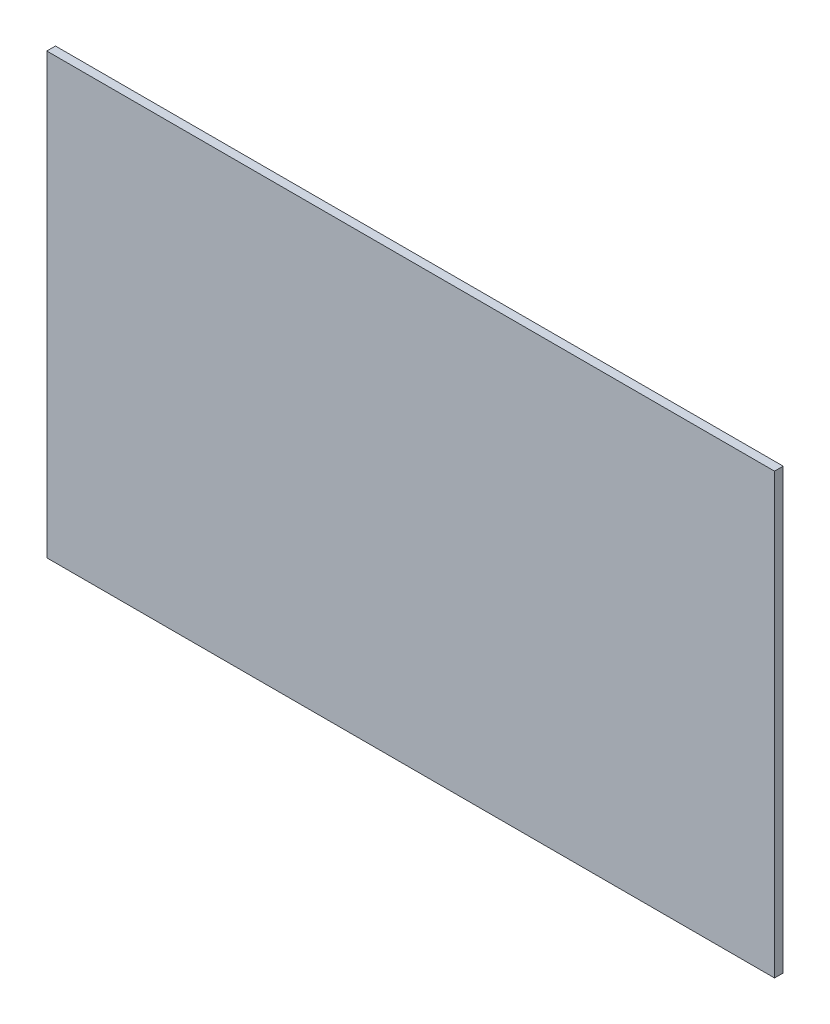
ISO-10303-21;
HEADER;
FILE_DESCRIPTION(('STEP AP214'),'2;1');
FILE_NAME('part.step','',(''),(''),'','','');
FILE_SCHEMA(('AUTOMOTIVE_DESIGN { 1 0 10303 214 1 1 1 1 }'));
ENDSEC;
DATA;
#1=APPLICATION_CONTEXT('core data for automotive mechanical design processes');
#2=APPLICATION_PROTOCOL_DEFINITION('international standard','automotive_design',2000,#1);
#3=PRODUCT_CONTEXT('',#1,'mechanical');
#4=PRODUCT('Part','Part','',(#3));
#5=PRODUCT_RELATED_PRODUCT_CATEGORY('part','',(#4));
#6=PRODUCT_DEFINITION_FORMATION('','',#4);
#7=PRODUCT_DEFINITION_CONTEXT('part definition',#1,'design');
#8=PRODUCT_DEFINITION('design','',#6,#7);
#9=PRODUCT_DEFINITION_SHAPE('','',#8);
#10=(LENGTH_UNIT() NAMED_UNIT(*) SI_UNIT(.MILLI.,.METRE.));
#11=(NAMED_UNIT(*) PLANE_ANGLE_UNIT() SI_UNIT($,.RADIAN.));
#12=(NAMED_UNIT(*) SI_UNIT($,.STERADIAN.) SOLID_ANGLE_UNIT());
#13=UNCERTAINTY_MEASURE_WITH_UNIT(LENGTH_MEASURE(1.E-05),#10,'distance_accuracy_value','');
#14=(GEOMETRIC_REPRESENTATION_CONTEXT(3) GLOBAL_UNCERTAINTY_ASSIGNED_CONTEXT((#13)) GLOBAL_UNIT_ASSIGNED_CONTEXT((#10,
#11,#12)) REPRESENTATION_CONTEXT('',''));
#15=CARTESIAN_POINT('',(0.,0.,0.));
#16=DIRECTION('',(0.,0.,1.));
#17=DIRECTION('',(1.,0.,0.));
#18=AXIS2_PLACEMENT_3D('',#15,#16,#17);
#19=CARTESIAN_POINT('',(0.,0.,19.05));
#20=DIRECTION('',(1.,0.,0.));
#21=DIRECTION('',(0.,1.,0.));
#22=AXIS2_PLACEMENT_3D('',#19,#20,#21);
#23=PLANE('',#22);
#24=DIRECTION('',(0.,-1.,0.));
#25=VECTOR('',#24,1.);
#26=CARTESIAN_POINT('',(0.,0.,0.));
#27=LINE('',#26,#25);
#28=CARTESIAN_POINT('',(0.,0.,0.));
#29=VERTEX_POINT('',#28);
#30=CARTESIAN_POINT('',(1.18202909053703E-13,-965.2,0.));
#31=VERTEX_POINT('',#30);
#32=EDGE_CURVE('E96',#29,#31,#27,.T.);
#33=ORIENTED_EDGE('',*,*,#32,.T.);
#34=DIRECTION('',(0.,0.,-1.));
#35=VECTOR('',#34,1.);
#36=CARTESIAN_POINT('',(1.18202909053703E-13,-965.2,19.05));
#37=LINE('',#36,#35);
#38=CARTESIAN_POINT('',(1.18202909053703E-13,-965.2,19.05));
#39=VERTEX_POINT('',#38);
#40=EDGE_CURVE('E11',#39,#31,#37,.T.);
#41=ORIENTED_EDGE('',*,*,#40,.F.);
#42=DIRECTION('',(0.,-1.,0.));
#43=VECTOR('',#42,1.);
#44=CARTESIAN_POINT('',(0.,0.,19.05));
#45=LINE('',#44,#43);
#46=CARTESIAN_POINT('',(0.,0.,19.05));
#47=VERTEX_POINT('',#46);
#48=EDGE_CURVE('E84',#47,#39,#45,.T.);
#49=ORIENTED_EDGE('',*,*,#48,.F.);
#50=DIRECTION('',(0.,0.,-1.));
#51=VECTOR('',#50,1.);
#52=CARTESIAN_POINT('',(0.,0.,19.05));
#53=LINE('',#52,#51);
#54=EDGE_CURVE('E92',#47,#29,#53,.T.);
#55=ORIENTED_EDGE('',*,*,#54,.T.);
#56=EDGE_LOOP('',(#33,#41,#49,#55));
#57=FACE_BOUND('',#56,.T.);
#58=ADVANCED_FACE('F33',(#57),#23,.F.);
#59=CARTESIAN_POINT('',(1.18202909053703E-13,-965.2,19.05));
#60=DIRECTION('',(0.,1.,0.));
#61=DIRECTION('',(0.,0.,1.));
#62=AXIS2_PLACEMENT_3D('',#59,#60,#61);
#63=PLANE('',#62);
#64=DIRECTION('',(1.,0.,0.));
#65=VECTOR('',#64,1.);
#66=CARTESIAN_POINT('',(1.18202909053703E-13,-965.2,0.));
#67=LINE('',#66,#65);
#68=CARTESIAN_POINT('',(1600.2,-965.2,0.));
#69=VERTEX_POINT('',#68);
#70=EDGE_CURVE('E88',#31,#69,#67,.T.);
#71=ORIENTED_EDGE('',*,*,#70,.T.);
#72=DIRECTION('',(0.,0.,-1.));
#73=VECTOR('',#72,1.);
#74=CARTESIAN_POINT('',(1600.2,-965.2,19.05));
#75=LINE('',#74,#73);
#76=CARTESIAN_POINT('',(1600.2,-965.2,19.05));
#77=VERTEX_POINT('',#76);
#78=EDGE_CURVE('E41',#77,#69,#75,.T.);
#79=ORIENTED_EDGE('',*,*,#78,.F.);
#80=DIRECTION('',(1.,0.,0.));
#81=VECTOR('',#80,1.);
#82=CARTESIAN_POINT('',(1.18202909053703E-13,-965.2,19.05));
#83=LINE('',#82,#81);
#84=EDGE_CURVE('E79',#39,#77,#83,.T.);
#85=ORIENTED_EDGE('',*,*,#84,.F.);
#86=ORIENTED_EDGE('',*,*,#40,.T.);
#87=EDGE_LOOP('',(#71,#79,#85,#86));
#88=FACE_BOUND('',#87,.T.);
#89=ADVANCED_FACE('F87',(#88),#63,.F.);
#90=CARTESIAN_POINT('',(1600.2,0.,19.05));
#91=DIRECTION('',(-1.,0.,0.));
#92=DIRECTION('',(0.,-1.,0.));
#93=AXIS2_PLACEMENT_3D('',#90,#91,#92);
#94=PLANE('',#93);
#95=DIRECTION('',(0.,1.,0.));
#96=VECTOR('',#95,1.);
#97=CARTESIAN_POINT('',(1600.2,0.,0.));
#98=LINE('',#97,#96);
#99=CARTESIAN_POINT('',(1600.2,0.,0.));
#100=VERTEX_POINT('',#99);
#101=EDGE_CURVE('E66',#69,#100,#98,.T.);
#102=ORIENTED_EDGE('',*,*,#101,.T.);
#103=DIRECTION('',(0.,0.,-1.));
#104=VECTOR('',#103,1.);
#105=CARTESIAN_POINT('',(1600.2,0.,19.05));
#106=LINE('',#105,#104);
#107=CARTESIAN_POINT('',(1600.2,0.,19.05));
#108=VERTEX_POINT('',#107);
#109=EDGE_CURVE('E89',#108,#100,#106,.T.);
#110=ORIENTED_EDGE('',*,*,#109,.F.);
#111=DIRECTION('',(0.,1.,0.));
#112=VECTOR('',#111,1.);
#113=CARTESIAN_POINT('',(1600.2,0.,19.05));
#114=LINE('',#113,#112);
#115=EDGE_CURVE('E82',#77,#108,#114,.T.);
#116=ORIENTED_EDGE('',*,*,#115,.F.);
#117=ORIENTED_EDGE('',*,*,#78,.T.);
#118=EDGE_LOOP('',(#102,#110,#116,#117));
#119=FACE_BOUND('',#118,.T.);
#120=ADVANCED_FACE('F90',(#119),#94,.F.);
#121=CARTESIAN_POINT('',(0.,0.,19.05));
#122=DIRECTION('',(0.,-1.,0.));
#123=DIRECTION('',(0.,0.,-1.));
#124=AXIS2_PLACEMENT_3D('',#121,#122,#123);
#125=PLANE('',#124);
#126=DIRECTION('',(-1.,0.,0.));
#127=VECTOR('',#126,1.);
#128=CARTESIAN_POINT('',(0.,0.,0.));
#129=LINE('',#128,#127);
#130=EDGE_CURVE('E72',#100,#29,#129,.T.);
#131=ORIENTED_EDGE('',*,*,#130,.T.);
#132=ORIENTED_EDGE('',*,*,#54,.F.);
#133=DIRECTION('',(-1.,0.,0.));
#134=VECTOR('',#133,1.);
#135=CARTESIAN_POINT('',(0.,0.,19.05));
#136=LINE('',#135,#134);
#137=EDGE_CURVE('E49',#108,#47,#136,.T.);
#138=ORIENTED_EDGE('',*,*,#137,.F.);
#139=ORIENTED_EDGE('',*,*,#109,.T.);
#140=EDGE_LOOP('',(#131,#132,#138,#139));
#141=FACE_BOUND('',#140,.T.);
#142=ADVANCED_FACE('F103',(#141),#125,.F.);
#143=CARTESIAN_POINT('',(0.,0.,19.05));
#144=DIRECTION('',(0.,0.,1.));
#145=DIRECTION('',(1.,0.,0.));
#146=AXIS2_PLACEMENT_3D('',#143,#144,#145);
#147=PLANE('',#146);
#148=ORIENTED_EDGE('',*,*,#48,.T.);
#149=ORIENTED_EDGE('',*,*,#84,.T.);
#150=ORIENTED_EDGE('',*,*,#115,.T.);
#151=ORIENTED_EDGE('',*,*,#137,.T.);
#152=EDGE_LOOP('',(#148,#149,#150,#151));
#153=FACE_BOUND('',#152,.T.);
#154=ADVANCED_FACE('F80',(#153),#147,.T.);
#155=CARTESIAN_POINT('',(0.,0.,0.));
#156=DIRECTION('',(0.,0.,1.));
#157=DIRECTION('',(1.,0.,0.));
#158=AXIS2_PLACEMENT_3D('',#155,#156,#157);
#159=PLANE('',#158);
#160=ORIENTED_EDGE('',*,*,#32,.F.);
#161=ORIENTED_EDGE('',*,*,#130,.F.);
#162=ORIENTED_EDGE('',*,*,#101,.F.);
#163=ORIENTED_EDGE('',*,*,#70,.F.);
#164=EDGE_LOOP('',(#160,#161,#162,#163));
#165=FACE_BOUND('',#164,.T.);
#166=ADVANCED_FACE('F106',(#165),#159,.F.);
#167=CLOSED_SHELL('',(#58,#89,#120,#142,#154,#166));
#168=MANIFOLD_SOLID_BREP('B2',#167);
#169=ADVANCED_BREP_SHAPE_REPRESENTATION('',(#18,#168),#14);
#170=SHAPE_DEFINITION_REPRESENTATION(#9,#169);
ENDSEC;
END-ISO-10303-21;
